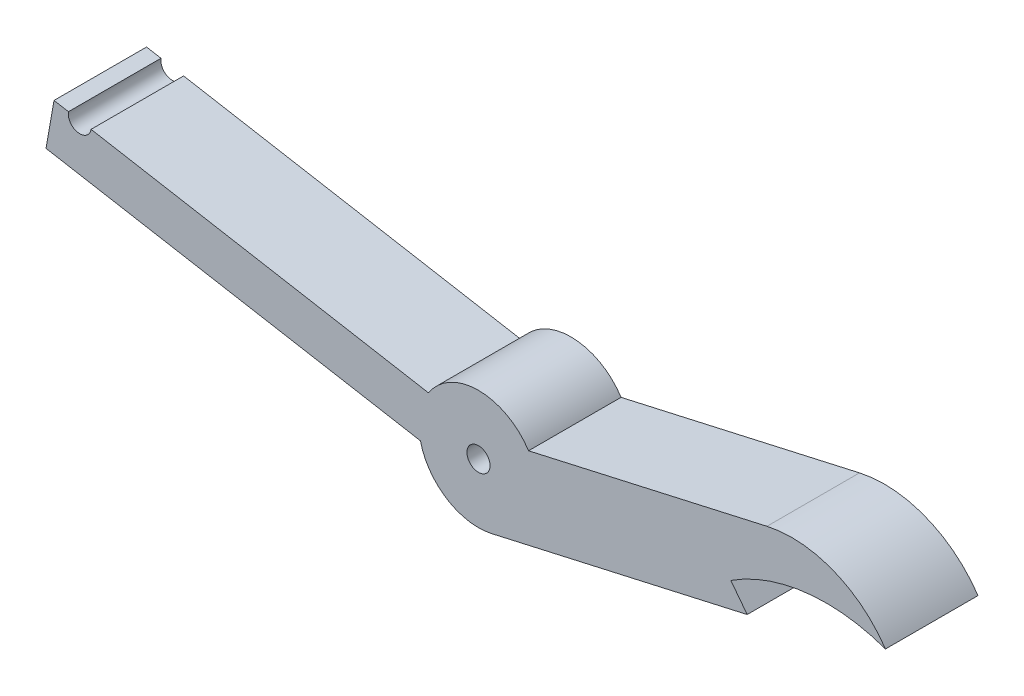
ISO-10303-21;
HEADER;
FILE_DESCRIPTION(('STEP AP214'),'2;1');
FILE_NAME('part.step','',(''),(''),'','','');
FILE_SCHEMA(('AUTOMOTIVE_DESIGN { 1 0 10303 214 1 1 1 1 }'));
ENDSEC;
DATA;
#1=APPLICATION_CONTEXT('core data for automotive mechanical design processes');
#2=APPLICATION_PROTOCOL_DEFINITION('international standard','automotive_design',2000,#1);
#3=PRODUCT_CONTEXT('',#1,'mechanical');
#4=PRODUCT('Part','Part','',(#3));
#5=PRODUCT_RELATED_PRODUCT_CATEGORY('part','',(#4));
#6=PRODUCT_DEFINITION_FORMATION('','',#4);
#7=PRODUCT_DEFINITION_CONTEXT('part definition',#1,'design');
#8=PRODUCT_DEFINITION('design','',#6,#7);
#9=PRODUCT_DEFINITION_SHAPE('','',#8);
#10=(LENGTH_UNIT() NAMED_UNIT(*) SI_UNIT(.MILLI.,.METRE.));
#11=(NAMED_UNIT(*) PLANE_ANGLE_UNIT() SI_UNIT($,.RADIAN.));
#12=(NAMED_UNIT(*) SI_UNIT($,.STERADIAN.) SOLID_ANGLE_UNIT());
#13=UNCERTAINTY_MEASURE_WITH_UNIT(LENGTH_MEASURE(1.E-05),#10,'distance_accuracy_value','');
#14=(GEOMETRIC_REPRESENTATION_CONTEXT(3) GLOBAL_UNCERTAINTY_ASSIGNED_CONTEXT((#13)) GLOBAL_UNIT_ASSIGNED_CONTEXT((#10,
#11,#12)) REPRESENTATION_CONTEXT('',''));
#15=CARTESIAN_POINT('',(0.,0.,0.));
#16=DIRECTION('',(0.,0.,1.));
#17=DIRECTION('',(1.,0.,0.));
#18=AXIS2_PLACEMENT_3D('',#15,#16,#17);
#19=CARTESIAN_POINT('',(0.,0.,6.35));
#20=DIRECTION('',(0.,0.,1.));
#21=DIRECTION('',(1.,0.,0.));
#22=AXIS2_PLACEMENT_3D('',#19,#20,#21);
#23=PLANE('',#22);
#24=CARTESIAN_POINT('',(0.,0.,6.35));
#25=DIRECTION('',(0.,0.,1.));
#26=DIRECTION('',(1.,0.,0.));
#27=AXIS2_PLACEMENT_3D('',#24,#25,#26);
#28=CIRCLE('',#27,8.1661);
#29=CARTESIAN_POINT('',(6.86979140393997,4.4148788518319,6.35));
#30=VERTEX_POINT('',#29);
#31=CARTESIAN_POINT('',(-6.85796712096746,4.43322412897535,6.35));
#32=VERTEX_POINT('',#31);
#33=EDGE_CURVE('E179',#30,#32,#28,.T.);
#34=ORIENTED_EDGE('',*,*,#33,.T.);
#35=DIRECTION('',(-0.984807753012208,0.173648177666931,0.));
#36=VECTOR('',#35,1.);
#37=CARTESIAN_POINT('',(-6.85796712096746,4.43322412897535,6.35));
#38=LINE('',#37,#36);
#39=CARTESIAN_POINT('',(-53.1755262298502,12.6002594804305,6.35));
#40=VERTEX_POINT('',#39);
#41=EDGE_CURVE('E107',#32,#40,#38,.T.);
#42=ORIENTED_EDGE('',*,*,#41,.T.);
#43=CARTESIAN_POINT('',(-54.7264014792938,12.8737206306204,6.35));
#44=DIRECTION('',(0.,0.,-1.));
#45=DIRECTION('',(1.,0.,0.));
#46=AXIS2_PLACEMENT_3D('',#43,#44,#45);
#47=CIRCLE('',#46,1.5748);
#48=CARTESIAN_POINT('',(-56.2772767287374,13.1471817808103,6.35));
#49=VERTEX_POINT('',#48);
#50=EDGE_CURVE('E206',#40,#49,#47,.T.);
#51=ORIENTED_EDGE('',*,*,#50,.T.);
#52=DIRECTION('',(-0.984807753012208,0.17364817766693,0.));
#53=VECTOR('',#52,1.);
#54=CARTESIAN_POINT('',(-56.2772767287374,13.1471817808103,6.35));
#55=LINE('',#54,#53);
#56=CARTESIAN_POINT('',(-58.2573191822893,13.4963166883197,6.35));
#57=VERTEX_POINT('',#56);
#58=EDGE_CURVE('E225',#49,#57,#55,.T.);
#59=ORIENTED_EDGE('',*,*,#58,.T.);
#60=DIRECTION('',(-0.173648177666931,-0.984807753012208,0.));
#61=VECTOR('',#60,1.);
#62=CARTESIAN_POINT('',(-58.2573191822893,13.4963166883197,6.35));
#63=LINE('',#62,#61);
#64=CARTESIAN_POINT('',(-59.3599851104743,7.24278745669213,6.35));
#65=VERTEX_POINT('',#64);
#66=EDGE_CURVE('E222',#57,#65,#63,.T.);
#67=ORIENTED_EDGE('',*,*,#66,.T.);
#68=DIRECTION('',(0.984807753012208,-0.17364817766693,0.));
#69=VECTOR('',#68,1.);
#70=CARTESIAN_POINT('',(-7.96063304915247,-1.82030510265216,6.35));
#71=LINE('',#70,#69);
#72=CARTESIAN_POINT('',(-7.96063304915247,-1.82030510265216,6.35));
#73=VERTEX_POINT('',#72);
#74=EDGE_CURVE('E224',#65,#73,#71,.T.);
#75=ORIENTED_EDGE('',*,*,#74,.T.);
#76=CARTESIAN_POINT('',(0.,0.,6.35));
#77=DIRECTION('',(0.,0.,1.));
#78=DIRECTION('',(1.,0.,0.));
#79=AXIS2_PLACEMENT_3D('',#76,#77,#78);
#80=CIRCLE('',#79,8.1661);
#81=CARTESIAN_POINT('',(1.7668563255075,-7.97266630024198,6.35));
#82=VERTEX_POINT('',#81);
#83=EDGE_CURVE('E227',#73,#82,#80,.T.);
#84=ORIENTED_EDGE('',*,*,#83,.T.);
#85=DIRECTION('',(0.975461826345997,0.220168629331548,0.));
#86=VECTOR('',#85,1.);
#87=CARTESIAN_POINT('',(1.7668563255075,-7.97266630024198,6.35));
#88=LINE('',#87,#86);
#89=CARTESIAN_POINT('',(36.8810507217623,-0.047144417684228,6.35));
#90=VERTEX_POINT('',#89);
#91=EDGE_CURVE('E233',#82,#90,#88,.T.);
#92=ORIENTED_EDGE('',*,*,#91,.T.);
#93=DIRECTION('',(-0.607545349691312,0.794284991717999,0.));
#94=VECTOR('',#93,1.);
#95=CARTESIAN_POINT('',(36.8810507217623,-0.047144417684228,6.35));
#96=LINE('',#95,#94);
#97=CARTESIAN_POINT('',(34.6351859776379,2.88902596135489,6.35));
#98=VERTEX_POINT('',#97);
#99=EDGE_CURVE('E138',#90,#98,#96,.T.);
#100=ORIENTED_EDGE('',*,*,#99,.T.);
#101=CARTESIAN_POINT('',(47.7363851359241,-17.3746232809441,6.35));
#102=DIRECTION('',(0.,0.,-1.));
#103=DIRECTION('',(-1.,0.,0.));
#104=AXIS2_PLACEMENT_3D('',#101,#102,#103);
#105=CIRCLE('',#104,24.1300000000001);
#106=CARTESIAN_POINT('',(55.8608218217203,5.34652168445088,6.35));
#107=VERTEX_POINT('',#106);
#108=EDGE_CURVE('E132',#98,#107,#105,.T.);
#109=ORIENTED_EDGE('',*,*,#108,.T.);
#110=CARTESIAN_POINT('',(43.0085552868671,-3.31896312374581,6.35));
#111=DIRECTION('',(0.,0.,1.));
#112=DIRECTION('',(-1.,0.,0.));
#113=AXIS2_PLACEMENT_3D('',#110,#111,#112);
#114=CIRCLE('',#113,15.5006897280088);
#115=CARTESIAN_POINT('',(39.5957896757576,11.8013679879603,6.35));
#116=VERTEX_POINT('',#115);
#117=EDGE_CURVE('E136',#107,#116,#114,.T.);
#118=ORIENTED_EDGE('',*,*,#117,.T.);
#119=DIRECTION('',(-0.975461826345997,-0.220168629331548,0.));
#120=VECTOR('',#119,1.);
#121=CARTESIAN_POINT('',(6.86979140393997,4.4148788518319,6.35));
#122=LINE('',#121,#120);
#123=EDGE_CURVE('E52',#116,#30,#122,.T.);
#124=ORIENTED_EDGE('',*,*,#123,.T.);
#125=EDGE_LOOP('',(#34,#42,#51,#59,#67,#75,#84,#92,#100,#109,#118,#124));
#126=FACE_BOUND('',#125,.T.);
#127=CARTESIAN_POINT('',(0.,0.,6.35));
#128=DIRECTION('',(0.,0.,1.));
#129=DIRECTION('',(1.,0.,0.));
#130=AXIS2_PLACEMENT_3D('',#127,#128,#129);
#131=CIRCLE('',#130,1.5875);
#132=CARTESIAN_POINT('',(1.5875,0.,6.35));
#133=VERTEX_POINT('',#132);
#134=EDGE_CURVE('E160',#133,#133,#131,.T.);
#135=ORIENTED_EDGE('',*,*,#134,.F.);
#136=EDGE_LOOP('',(#135));
#137=FACE_BOUND('',#136,.T.);
#138=ADVANCED_FACE('F35',(#126,#137),#23,.T.);
#139=CARTESIAN_POINT('',(0.,0.,-6.35));
#140=DIRECTION('',(0.,0.,1.));
#141=DIRECTION('',(1.,0.,0.));
#142=AXIS2_PLACEMENT_3D('',#139,#140,#141);
#143=PLANE('',#142);
#144=CARTESIAN_POINT('',(0.,0.,-6.35));
#145=DIRECTION('',(0.,0.,1.));
#146=DIRECTION('',(1.,0.,0.));
#147=AXIS2_PLACEMENT_3D('',#144,#145,#146);
#148=CIRCLE('',#147,8.1661);
#149=CARTESIAN_POINT('',(6.86979140393997,4.4148788518319,-6.35));
#150=VERTEX_POINT('',#149);
#151=CARTESIAN_POINT('',(-6.85796712096746,4.43322412897535,-6.35));
#152=VERTEX_POINT('',#151);
#153=EDGE_CURVE('E156',#150,#152,#148,.T.);
#154=ORIENTED_EDGE('',*,*,#153,.F.);
#155=DIRECTION('',(-0.975461826345997,-0.220168629331548,0.));
#156=VECTOR('',#155,1.);
#157=CARTESIAN_POINT('',(6.86979140393997,4.4148788518319,-6.35));
#158=LINE('',#157,#156);
#159=CARTESIAN_POINT('',(39.5957896757576,11.8013679879603,-6.35));
#160=VERTEX_POINT('',#159);
#161=EDGE_CURVE('E99',#160,#150,#158,.T.);
#162=ORIENTED_EDGE('',*,*,#161,.F.);
#163=CARTESIAN_POINT('',(43.0085552868671,-3.31896312374581,-6.35));
#164=DIRECTION('',(0.,0.,1.));
#165=DIRECTION('',(-1.,0.,0.));
#166=AXIS2_PLACEMENT_3D('',#163,#164,#165);
#167=CIRCLE('',#166,15.5006897280088);
#168=CARTESIAN_POINT('',(55.8608218217203,5.34652168445088,-6.35));
#169=VERTEX_POINT('',#168);
#170=EDGE_CURVE('E93',#169,#160,#167,.T.);
#171=ORIENTED_EDGE('',*,*,#170,.F.);
#172=CARTESIAN_POINT('',(47.7363851359241,-17.3746232809441,-6.35));
#173=DIRECTION('',(0.,0.,-1.));
#174=DIRECTION('',(-1.,0.,0.));
#175=AXIS2_PLACEMENT_3D('',#172,#173,#174);
#176=CIRCLE('',#175,24.1300000000001);
#177=CARTESIAN_POINT('',(34.6351859776379,2.88902596135489,-6.35));
#178=VERTEX_POINT('',#177);
#179=EDGE_CURVE('E146',#178,#169,#176,.T.);
#180=ORIENTED_EDGE('',*,*,#179,.F.);
#181=DIRECTION('',(-0.607545349691312,0.794284991717999,0.));
#182=VECTOR('',#181,1.);
#183=CARTESIAN_POINT('',(36.8810507217623,-0.047144417684228,-6.35));
#184=LINE('',#183,#182);
#185=CARTESIAN_POINT('',(36.8810507217623,-0.047144417684228,-6.35));
#186=VERTEX_POINT('',#185);
#187=EDGE_CURVE('E174',#186,#178,#184,.T.);
#188=ORIENTED_EDGE('',*,*,#187,.F.);
#189=DIRECTION('',(0.975461826345997,0.220168629331548,0.));
#190=VECTOR('',#189,1.);
#191=CARTESIAN_POINT('',(1.7668563255075,-7.97266630024198,-6.35));
#192=LINE('',#191,#190);
#193=CARTESIAN_POINT('',(1.7668563255075,-7.97266630024198,-6.35));
#194=VERTEX_POINT('',#193);
#195=EDGE_CURVE('E172',#194,#186,#192,.T.);
#196=ORIENTED_EDGE('',*,*,#195,.F.);
#197=CARTESIAN_POINT('',(0.,0.,-6.35));
#198=DIRECTION('',(0.,0.,1.));
#199=DIRECTION('',(1.,0.,0.));
#200=AXIS2_PLACEMENT_3D('',#197,#198,#199);
#201=CIRCLE('',#200,8.1661);
#202=CARTESIAN_POINT('',(-7.96063304915247,-1.82030510265216,-6.35));
#203=VERTEX_POINT('',#202);
#204=EDGE_CURVE('E170',#203,#194,#201,.T.);
#205=ORIENTED_EDGE('',*,*,#204,.F.);
#206=DIRECTION('',(0.984807753012208,-0.17364817766693,0.));
#207=VECTOR('',#206,1.);
#208=CARTESIAN_POINT('',(-7.96063304915247,-1.82030510265216,-6.35));
#209=LINE('',#208,#207);
#210=CARTESIAN_POINT('',(-59.3599851104743,7.24278745669213,-6.35));
#211=VERTEX_POINT('',#210);
#212=EDGE_CURVE('E168',#211,#203,#209,.T.);
#213=ORIENTED_EDGE('',*,*,#212,.F.);
#214=DIRECTION('',(-0.173648177666931,-0.984807753012208,0.));
#215=VECTOR('',#214,1.);
#216=CARTESIAN_POINT('',(-58.2573191822893,13.4963166883197,-6.35));
#217=LINE('',#216,#215);
#218=CARTESIAN_POINT('',(-58.2573191822893,13.4963166883197,-6.35));
#219=VERTEX_POINT('',#218);
#220=EDGE_CURVE('E166',#219,#211,#217,.T.);
#221=ORIENTED_EDGE('',*,*,#220,.F.);
#222=DIRECTION('',(-0.984807753012208,0.17364817766693,0.));
#223=VECTOR('',#222,1.);
#224=CARTESIAN_POINT('',(-56.2772767287374,13.1471817808103,-6.35));
#225=LINE('',#224,#223);
#226=CARTESIAN_POINT('',(-56.2772767287374,13.1471817808103,-6.35));
#227=VERTEX_POINT('',#226);
#228=EDGE_CURVE('E164',#227,#219,#225,.T.);
#229=ORIENTED_EDGE('',*,*,#228,.F.);
#230=CARTESIAN_POINT('',(-54.7264014792938,12.8737206306204,-6.35));
#231=DIRECTION('',(0.,0.,-1.));
#232=DIRECTION('',(1.,0.,0.));
#233=AXIS2_PLACEMENT_3D('',#230,#231,#232);
#234=CIRCLE('',#233,1.5748);
#235=CARTESIAN_POINT('',(-53.1755262298502,12.6002594804305,-6.35));
#236=VERTEX_POINT('',#235);
#237=EDGE_CURVE('E162',#236,#227,#234,.T.);
#238=ORIENTED_EDGE('',*,*,#237,.F.);
#239=DIRECTION('',(-0.984807753012208,0.173648177666931,0.));
#240=VECTOR('',#239,1.);
#241=CARTESIAN_POINT('',(-6.85796712096746,4.43322412897535,-6.35));
#242=LINE('',#241,#240);
#243=EDGE_CURVE('E159',#152,#236,#242,.T.);
#244=ORIENTED_EDGE('',*,*,#243,.F.);
#245=EDGE_LOOP('',(#154,#162,#171,#180,#188,#196,#205,#213,#221,#229,#238,#244));
#246=FACE_BOUND('',#245,.T.);
#247=CARTESIAN_POINT('',(0.,0.,-6.35));
#248=DIRECTION('',(0.,0.,1.));
#249=DIRECTION('',(1.,0.,0.));
#250=AXIS2_PLACEMENT_3D('',#247,#248,#249);
#251=CIRCLE('',#250,1.5875);
#252=CARTESIAN_POINT('',(1.5875,0.,-6.35));
#253=VERTEX_POINT('',#252);
#254=EDGE_CURVE('E380',#253,#253,#251,.T.);
#255=ORIENTED_EDGE('',*,*,#254,.T.);
#256=EDGE_LOOP('',(#255));
#257=FACE_BOUND('',#256,.T.);
#258=ADVANCED_FACE('F210',(#246,#257),#143,.F.);
#259=CARTESIAN_POINT('',(0.,0.,6.35));
#260=DIRECTION('',(0.,0.,-1.));
#261=DIRECTION('',(-1.,0.,0.));
#262=AXIS2_PLACEMENT_3D('',#259,#260,#261);
#263=CYLINDRICAL_SURFACE('',#262,8.1661);
#264=ORIENTED_EDGE('',*,*,#153,.T.);
#265=DIRECTION('',(0.,0.,-1.));
#266=VECTOR('',#265,1.);
#267=CARTESIAN_POINT('',(-6.85796712096746,4.43322412897535,6.35));
#268=LINE('',#267,#266);
#269=EDGE_CURVE('E11',#32,#152,#268,.T.);
#270=ORIENTED_EDGE('',*,*,#269,.F.);
#271=ORIENTED_EDGE('',*,*,#33,.F.);
#272=DIRECTION('',(0.,0.,-1.));
#273=VECTOR('',#272,1.);
#274=CARTESIAN_POINT('',(6.86979140393997,4.4148788518319,6.35));
#275=LINE('',#274,#273);
#276=EDGE_CURVE('E152',#30,#150,#275,.T.);
#277=ORIENTED_EDGE('',*,*,#276,.T.);
#278=EDGE_LOOP('',(#264,#270,#271,#277));
#279=FACE_BOUND('',#278,.T.);
#280=ADVANCED_FACE('F37',(#279),#263,.T.);
#281=CARTESIAN_POINT('',(-6.85796712096746,4.43322412897535,6.35));
#282=DIRECTION('',(-0.173648177666931,-0.984807753012208,0.));
#283=DIRECTION('',(0.984807753012208,-0.173648177666931,0.));
#284=AXIS2_PLACEMENT_3D('',#281,#282,#283);
#285=PLANE('',#284);
#286=ORIENTED_EDGE('',*,*,#243,.T.);
#287=DIRECTION('',(0.,0.,-1.));
#288=VECTOR('',#287,1.);
#289=CARTESIAN_POINT('',(-53.1755262298502,12.6002594804305,6.35));
#290=LINE('',#289,#288);
#291=EDGE_CURVE('E44',#40,#236,#290,.T.);
#292=ORIENTED_EDGE('',*,*,#291,.F.);
#293=ORIENTED_EDGE('',*,*,#41,.F.);
#294=ORIENTED_EDGE('',*,*,#269,.T.);
#295=EDGE_LOOP('',(#286,#292,#293,#294));
#296=FACE_BOUND('',#295,.T.);
#297=ADVANCED_FACE('F267',(#296),#285,.F.);
#298=CARTESIAN_POINT('',(-54.7264014792938,12.8737206306204,6.35));
#299=DIRECTION('',(0.,0.,-1.));
#300=DIRECTION('',(-1.,0.,0.));
#301=AXIS2_PLACEMENT_3D('',#298,#299,#300);
#302=CYLINDRICAL_SURFACE('',#301,1.5748);
#303=ORIENTED_EDGE('',*,*,#237,.T.);
#304=DIRECTION('',(0.,0.,-1.));
#305=VECTOR('',#304,1.);
#306=CARTESIAN_POINT('',(-56.2772767287374,13.1471817808103,6.35));
#307=LINE('',#306,#305);
#308=EDGE_CURVE('E198',#49,#227,#307,.T.);
#309=ORIENTED_EDGE('',*,*,#308,.F.);
#310=ORIENTED_EDGE('',*,*,#50,.F.);
#311=ORIENTED_EDGE('',*,*,#291,.T.);
#312=EDGE_LOOP('',(#303,#309,#310,#311));
#313=FACE_BOUND('',#312,.T.);
#314=ADVANCED_FACE('F204',(#313),#302,.F.);
#315=CARTESIAN_POINT('',(-56.2772767287374,13.1471817808103,6.35));
#316=DIRECTION('',(-0.17364817766693,-0.984807753012208,0.));
#317=DIRECTION('',(0.984807753012208,-0.17364817766693,0.));
#318=AXIS2_PLACEMENT_3D('',#315,#316,#317);
#319=PLANE('',#318);
#320=ORIENTED_EDGE('',*,*,#228,.T.);
#321=DIRECTION('',(0.,0.,-1.));
#322=VECTOR('',#321,1.);
#323=CARTESIAN_POINT('',(-58.2573191822893,13.4963166883197,6.35));
#324=LINE('',#323,#322);
#325=EDGE_CURVE('E195',#57,#219,#324,.T.);
#326=ORIENTED_EDGE('',*,*,#325,.F.);
#327=ORIENTED_EDGE('',*,*,#58,.F.);
#328=ORIENTED_EDGE('',*,*,#308,.T.);
#329=EDGE_LOOP('',(#320,#326,#327,#328));
#330=FACE_BOUND('',#329,.T.);
#331=ADVANCED_FACE('F216',(#330),#319,.F.);
#332=CARTESIAN_POINT('',(-58.2573191822893,13.4963166883197,6.35));
#333=DIRECTION('',(0.984807753012208,-0.173648177666931,0.));
#334=DIRECTION('',(0.173648177666931,0.984807753012208,0.));
#335=AXIS2_PLACEMENT_3D('',#332,#333,#334);
#336=PLANE('',#335);
#337=ORIENTED_EDGE('',*,*,#220,.T.);
#338=DIRECTION('',(0.,0.,-1.));
#339=VECTOR('',#338,1.);
#340=CARTESIAN_POINT('',(-59.3599851104743,7.24278745669213,6.35));
#341=LINE('',#340,#339);
#342=EDGE_CURVE('E192',#65,#211,#341,.T.);
#343=ORIENTED_EDGE('',*,*,#342,.F.);
#344=ORIENTED_EDGE('',*,*,#66,.F.);
#345=ORIENTED_EDGE('',*,*,#325,.T.);
#346=EDGE_LOOP('',(#337,#343,#344,#345));
#347=FACE_BOUND('',#346,.T.);
#348=ADVANCED_FACE('F220',(#347),#336,.F.);
#349=CARTESIAN_POINT('',(-7.96063304915247,-1.82030510265216,6.35));
#350=DIRECTION('',(0.17364817766693,0.984807753012208,0.));
#351=DIRECTION('',(-0.984807753012208,0.17364817766693,0.));
#352=AXIS2_PLACEMENT_3D('',#349,#350,#351);
#353=PLANE('',#352);
#354=ORIENTED_EDGE('',*,*,#212,.T.);
#355=DIRECTION('',(0.,0.,-1.));
#356=VECTOR('',#355,1.);
#357=CARTESIAN_POINT('',(-7.96063304915247,-1.82030510265216,6.35));
#358=LINE('',#357,#356);
#359=EDGE_CURVE('E189',#73,#203,#358,.T.);
#360=ORIENTED_EDGE('',*,*,#359,.F.);
#361=ORIENTED_EDGE('',*,*,#74,.F.);
#362=ORIENTED_EDGE('',*,*,#342,.T.);
#363=EDGE_LOOP('',(#354,#360,#361,#362));
#364=FACE_BOUND('',#363,.T.);
#365=ADVANCED_FACE('F280',(#364),#353,.F.);
#366=CARTESIAN_POINT('',(0.,0.,6.35));
#367=DIRECTION('',(0.,0.,-1.));
#368=DIRECTION('',(-1.,0.,0.));
#369=AXIS2_PLACEMENT_3D('',#366,#367,#368);
#370=CYLINDRICAL_SURFACE('',#369,8.1661);
#371=ORIENTED_EDGE('',*,*,#204,.T.);
#372=DIRECTION('',(0.,0.,-1.));
#373=VECTOR('',#372,1.);
#374=CARTESIAN_POINT('',(1.7668563255075,-7.97266630024198,6.35));
#375=LINE('',#374,#373);
#376=EDGE_CURVE('E186',#82,#194,#375,.T.);
#377=ORIENTED_EDGE('',*,*,#376,.F.);
#378=ORIENTED_EDGE('',*,*,#83,.F.);
#379=ORIENTED_EDGE('',*,*,#359,.T.);
#380=EDGE_LOOP('',(#371,#377,#378,#379));
#381=FACE_BOUND('',#380,.T.);
#382=ADVANCED_FACE('F283',(#381),#370,.T.);
#383=CARTESIAN_POINT('',(1.7668563255075,-7.97266630024198,6.35));
#384=DIRECTION('',(-0.220168629331548,0.975461826345997,0.));
#385=DIRECTION('',(-0.975461826345997,-0.220168629331548,0.));
#386=AXIS2_PLACEMENT_3D('',#383,#384,#385);
#387=PLANE('',#386);
#388=ORIENTED_EDGE('',*,*,#195,.T.);
#389=DIRECTION('',(0.,0.,-1.));
#390=VECTOR('',#389,1.);
#391=CARTESIAN_POINT('',(36.8810507217623,-0.047144417684228,6.35));
#392=LINE('',#391,#390);
#393=EDGE_CURVE('E183',#90,#186,#392,.T.);
#394=ORIENTED_EDGE('',*,*,#393,.F.);
#395=ORIENTED_EDGE('',*,*,#91,.F.);
#396=ORIENTED_EDGE('',*,*,#376,.T.);
#397=EDGE_LOOP('',(#388,#394,#395,#396));
#398=FACE_BOUND('',#397,.T.);
#399=ADVANCED_FACE('F239',(#398),#387,.F.);
#400=CARTESIAN_POINT('',(36.8810507217623,-0.047144417684228,6.35));
#401=DIRECTION('',(-0.794284991717999,-0.607545349691312,0.));
#402=DIRECTION('',(0.607545349691312,-0.794284991717999,0.));
#403=AXIS2_PLACEMENT_3D('',#400,#401,#402);
#404=PLANE('',#403);
#405=ORIENTED_EDGE('',*,*,#187,.T.);
#406=DIRECTION('',(0.,0.,-1.));
#407=VECTOR('',#406,1.);
#408=CARTESIAN_POINT('',(34.6351859776379,2.88902596135489,6.35));
#409=LINE('',#408,#407);
#410=EDGE_CURVE('E147',#98,#178,#409,.T.);
#411=ORIENTED_EDGE('',*,*,#410,.F.);
#412=ORIENTED_EDGE('',*,*,#99,.F.);
#413=ORIENTED_EDGE('',*,*,#393,.T.);
#414=EDGE_LOOP('',(#405,#411,#412,#413));
#415=FACE_BOUND('',#414,.T.);
#416=ADVANCED_FACE('F243',(#415),#404,.F.);
#417=CARTESIAN_POINT('',(47.7363851359241,-17.3746232809441,6.35));
#418=DIRECTION('',(0.,0.,-1.));
#419=DIRECTION('',(-1.,0.,0.));
#420=AXIS2_PLACEMENT_3D('',#417,#418,#419);
#421=CYLINDRICAL_SURFACE('',#420,24.1300000000001);
#422=ORIENTED_EDGE('',*,*,#179,.T.);
#423=DIRECTION('',(0.,0.,-1.));
#424=VECTOR('',#423,1.);
#425=CARTESIAN_POINT('',(55.8608218217203,5.34652168445088,6.35));
#426=LINE('',#425,#424);
#427=EDGE_CURVE('E143',#107,#169,#426,.T.);
#428=ORIENTED_EDGE('',*,*,#427,.F.);
#429=ORIENTED_EDGE('',*,*,#108,.F.);
#430=ORIENTED_EDGE('',*,*,#410,.T.);
#431=EDGE_LOOP('',(#422,#428,#429,#430));
#432=FACE_BOUND('',#431,.T.);
#433=ADVANCED_FACE('F144',(#432),#421,.F.);
#434=CARTESIAN_POINT('',(43.0085552868671,-3.31896312374581,6.35));
#435=DIRECTION('',(0.,0.,-1.));
#436=DIRECTION('',(-1.,0.,0.));
#437=AXIS2_PLACEMENT_3D('',#434,#435,#436);
#438=CYLINDRICAL_SURFACE('',#437,15.5006897280088);
#439=ORIENTED_EDGE('',*,*,#170,.T.);
#440=DIRECTION('',(0.,0.,-1.));
#441=VECTOR('',#440,1.);
#442=CARTESIAN_POINT('',(39.5957896757576,11.8013679879603,6.35));
#443=LINE('',#442,#441);
#444=EDGE_CURVE('E148',#116,#160,#443,.T.);
#445=ORIENTED_EDGE('',*,*,#444,.F.);
#446=ORIENTED_EDGE('',*,*,#117,.F.);
#447=ORIENTED_EDGE('',*,*,#427,.T.);
#448=EDGE_LOOP('',(#439,#445,#446,#447));
#449=FACE_BOUND('',#448,.T.);
#450=ADVANCED_FACE('F150',(#449),#438,.T.);
#451=CARTESIAN_POINT('',(6.86979140393997,4.4148788518319,6.35));
#452=DIRECTION('',(0.220168629331548,-0.975461826345997,0.));
#453=DIRECTION('',(0.975461826345997,0.220168629331548,0.));
#454=AXIS2_PLACEMENT_3D('',#451,#452,#453);
#455=PLANE('',#454);
#456=ORIENTED_EDGE('',*,*,#161,.T.);
#457=ORIENTED_EDGE('',*,*,#276,.F.);
#458=ORIENTED_EDGE('',*,*,#123,.F.);
#459=ORIENTED_EDGE('',*,*,#444,.T.);
#460=EDGE_LOOP('',(#456,#457,#458,#459));
#461=FACE_BOUND('',#460,.T.);
#462=ADVANCED_FACE('F247',(#461),#455,.F.);
#463=CARTESIAN_POINT('',(0.,0.,6.35));
#464=DIRECTION('',(0.,0.,-1.));
#465=DIRECTION('',(-1.,0.,0.));
#466=AXIS2_PLACEMENT_3D('',#463,#464,#465);
#467=CYLINDRICAL_SURFACE('',#466,1.5875);
#468=ORIENTED_EDGE('',*,*,#134,.T.);
#469=EDGE_LOOP('',(#468));
#470=FACE_BOUND('',#469,.T.);
#471=ORIENTED_EDGE('',*,*,#254,.F.);
#472=EDGE_LOOP('',(#471));
#473=FACE_BOUND('',#472,.T.);
#474=ADVANCED_FACE('F249',(#470,#473),#467,.F.);
#475=CLOSED_SHELL('',(#138,#258,#280,#297,#314,#331,#348,#365,#382,#399,#416,#433,#450,#462,#474));
#476=MANIFOLD_SOLID_BREP('B2',#475);
#477=ADVANCED_BREP_SHAPE_REPRESENTATION('',(#18,#476),#14);
#478=SHAPE_DEFINITION_REPRESENTATION(#9,#477);
ENDSEC;
END-ISO-10303-21;
